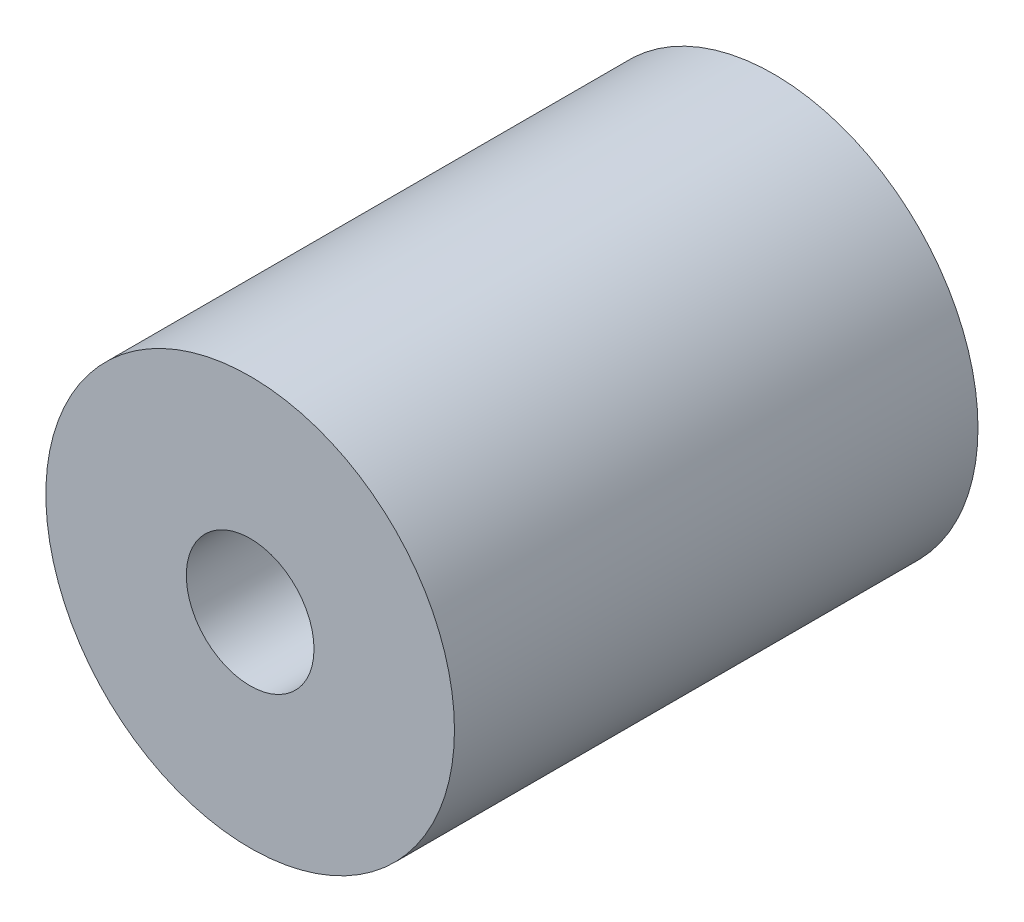
ISO-10303-21;
HEADER;
FILE_DESCRIPTION(('STEP AP214'),'2;1');
FILE_NAME('part.step','',(''),(''),'','','');
FILE_SCHEMA(('AUTOMOTIVE_DESIGN { 1 0 10303 214 1 1 1 1 }'));
ENDSEC;
DATA;
#1=APPLICATION_CONTEXT('core data for automotive mechanical design processes');
#2=APPLICATION_PROTOCOL_DEFINITION('international standard','automotive_design',2000,#1);
#3=PRODUCT_CONTEXT('',#1,'mechanical');
#4=PRODUCT('Part','Part','',(#3));
#5=PRODUCT_RELATED_PRODUCT_CATEGORY('part','',(#4));
#6=PRODUCT_DEFINITION_FORMATION('','',#4);
#7=PRODUCT_DEFINITION_CONTEXT('part definition',#1,'design');
#8=PRODUCT_DEFINITION('design','',#6,#7);
#9=PRODUCT_DEFINITION_SHAPE('','',#8);
#10=(LENGTH_UNIT() NAMED_UNIT(*) SI_UNIT(.MILLI.,.METRE.));
#11=(NAMED_UNIT(*) PLANE_ANGLE_UNIT() SI_UNIT($,.RADIAN.));
#12=(NAMED_UNIT(*) SI_UNIT($,.STERADIAN.) SOLID_ANGLE_UNIT());
#13=UNCERTAINTY_MEASURE_WITH_UNIT(LENGTH_MEASURE(1.E-05),#10,'distance_accuracy_value','');
#14=(GEOMETRIC_REPRESENTATION_CONTEXT(3) GLOBAL_UNCERTAINTY_ASSIGNED_CONTEXT((#13)) GLOBAL_UNIT_ASSIGNED_CONTEXT((#10,
#11,#12)) REPRESENTATION_CONTEXT('',''));
#15=CARTESIAN_POINT('',(0.,0.,0.));
#16=DIRECTION('',(0.,0.,1.));
#17=DIRECTION('',(1.,0.,0.));
#18=AXIS2_PLACEMENT_3D('',#15,#16,#17);
#19=CARTESIAN_POINT('',(0.,0.,0.));
#20=DIRECTION('',(0.,0.,1.));
#21=DIRECTION('',(1.,0.,0.));
#22=AXIS2_PLACEMENT_3D('',#19,#20,#21);
#23=CYLINDRICAL_SURFACE('',#22,5.);
#24=CARTESIAN_POINT('',(0.,0.,41.));
#25=DIRECTION('',(0.,0.,1.));
#26=DIRECTION('',(1.,0.,0.));
#27=AXIS2_PLACEMENT_3D('',#24,#25,#26);
#28=CIRCLE('',#27,5.);
#29=CARTESIAN_POINT('',(5.,0.,41.));
#30=VERTEX_POINT('',#29);
#31=EDGE_CURVE('E43',#30,#30,#28,.T.);
#32=ORIENTED_EDGE('',*,*,#31,.T.);
#33=EDGE_LOOP('',(#32));
#34=FACE_BOUND('',#33,.T.);
#35=CARTESIAN_POINT('',(0.,0.,12.));
#36=DIRECTION('',(0.,0.,-1.));
#37=DIRECTION('',(-1.,0.,0.));
#38=AXIS2_PLACEMENT_3D('',#35,#36,#37);
#39=CIRCLE('',#38,5.);
#40=CARTESIAN_POINT('',(-5.,0.,12.));
#41=VERTEX_POINT('',#40);
#42=EDGE_CURVE('E34',#41,#41,#39,.F.);
#43=ORIENTED_EDGE('',*,*,#42,.F.);
#44=EDGE_LOOP('',(#43));
#45=FACE_BOUND('',#44,.T.);
#46=ADVANCED_FACE('F30',(#34,#45),#23,.F.);
#47=CARTESIAN_POINT('',(0.,0.,41.));
#48=DIRECTION('',(0.,0.,-1.));
#49=DIRECTION('',(-1.,0.,0.));
#50=AXIS2_PLACEMENT_3D('',#47,#48,#49);
#51=CYLINDRICAL_SURFACE('',#50,16.);
#52=CARTESIAN_POINT('',(0.,0.,41.));
#53=DIRECTION('',(0.,0.,1.));
#54=DIRECTION('',(1.,0.,0.));
#55=AXIS2_PLACEMENT_3D('',#52,#53,#54);
#56=CIRCLE('',#55,16.);
#57=CARTESIAN_POINT('',(16.,0.,41.));
#58=VERTEX_POINT('',#57);
#59=EDGE_CURVE('E10',#58,#58,#56,.T.);
#60=ORIENTED_EDGE('',*,*,#59,.F.);
#61=EDGE_LOOP('',(#60));
#62=FACE_BOUND('',#61,.T.);
#63=CARTESIAN_POINT('',(0.,0.,0.));
#64=DIRECTION('',(0.,0.,1.));
#65=DIRECTION('',(1.,0.,0.));
#66=AXIS2_PLACEMENT_3D('',#63,#64,#65);
#67=CIRCLE('',#66,16.);
#68=CARTESIAN_POINT('',(16.,0.,0.));
#69=VERTEX_POINT('',#68);
#70=EDGE_CURVE('E38',#69,#69,#67,.T.);
#71=ORIENTED_EDGE('',*,*,#70,.T.);
#72=EDGE_LOOP('',(#71));
#73=FACE_BOUND('',#72,.T.);
#74=ADVANCED_FACE('F32',(#62,#73),#51,.T.);
#75=CARTESIAN_POINT('',(0.,0.,41.));
#76=DIRECTION('',(0.,0.,1.));
#77=DIRECTION('',(1.,0.,0.));
#78=AXIS2_PLACEMENT_3D('',#75,#76,#77);
#79=PLANE('',#78);
#80=ORIENTED_EDGE('',*,*,#31,.F.);
#81=EDGE_LOOP('',(#80));
#82=FACE_BOUND('',#81,.T.);
#83=ORIENTED_EDGE('',*,*,#59,.T.);
#84=EDGE_LOOP('',(#83));
#85=FACE_BOUND('',#84,.T.);
#86=ADVANCED_FACE('F65',(#82,#85),#79,.T.);
#87=CARTESIAN_POINT('',(0.,0.,0.));
#88=DIRECTION('',(0.,0.,1.));
#89=DIRECTION('',(1.,0.,0.));
#90=AXIS2_PLACEMENT_3D('',#87,#88,#89);
#91=PLANE('',#90);
#92=CARTESIAN_POINT('',(0.,0.,0.));
#93=DIRECTION('',(0.,0.,-1.));
#94=DIRECTION('',(-1.,0.,0.));
#95=AXIS2_PLACEMENT_3D('',#92,#93,#94);
#96=CIRCLE('',#95,7.);
#97=CARTESIAN_POINT('',(-7.,0.,0.));
#98=VERTEX_POINT('',#97);
#99=EDGE_CURVE('E47',#98,#98,#96,.T.);
#100=ORIENTED_EDGE('',*,*,#99,.F.);
#101=EDGE_LOOP('',(#100));
#102=FACE_BOUND('',#101,.T.);
#103=ORIENTED_EDGE('',*,*,#70,.F.);
#104=EDGE_LOOP('',(#103));
#105=FACE_BOUND('',#104,.T.);
#106=ADVANCED_FACE('F72',(#102,#105),#91,.F.);
#107=CARTESIAN_POINT('',(0.,0.,12.));
#108=DIRECTION('',(0.,0.,-1.));
#109=DIRECTION('',(-1.,0.,0.));
#110=AXIS2_PLACEMENT_3D('',#107,#108,#109);
#111=PLANE('',#110);
#112=CARTESIAN_POINT('',(0.,0.,12.));
#113=DIRECTION('',(0.,0.,-1.));
#114=DIRECTION('',(-1.,0.,0.));
#115=AXIS2_PLACEMENT_3D('',#112,#113,#114);
#116=CIRCLE('',#115,7.);
#117=CARTESIAN_POINT('',(-7.,0.,12.));
#118=VERTEX_POINT('',#117);
#119=EDGE_CURVE('E50',#118,#118,#116,.T.);
#120=ORIENTED_EDGE('',*,*,#119,.T.);
#121=EDGE_LOOP('',(#120));
#122=FACE_BOUND('',#121,.T.);
#123=ORIENTED_EDGE('',*,*,#42,.T.);
#124=EDGE_LOOP('',(#123));
#125=FACE_BOUND('',#124,.T.);
#126=ADVANCED_FACE('F57',(#122,#125),#111,.T.);
#127=CARTESIAN_POINT('',(0.,0.,12.));
#128=DIRECTION('',(0.,0.,-1.));
#129=DIRECTION('',(-1.,0.,0.));
#130=AXIS2_PLACEMENT_3D('',#127,#128,#129);
#131=CYLINDRICAL_SURFACE('',#130,7.);
#132=ORIENTED_EDGE('',*,*,#119,.F.);
#133=EDGE_LOOP('',(#132));
#134=FACE_BOUND('',#133,.T.);
#135=ORIENTED_EDGE('',*,*,#99,.T.);
#136=EDGE_LOOP('',(#135));
#137=FACE_BOUND('',#136,.T.);
#138=ADVANCED_FACE('F69',(#134,#137),#131,.F.);
#139=CLOSED_SHELL('',(#46,#74,#86,#106,#126,#138));
#140=MANIFOLD_SOLID_BREP('B2',#139);
#141=ADVANCED_BREP_SHAPE_REPRESENTATION('',(#18,#140),#14);
#142=SHAPE_DEFINITION_REPRESENTATION(#9,#141);
ENDSEC;
END-ISO-10303-21;
